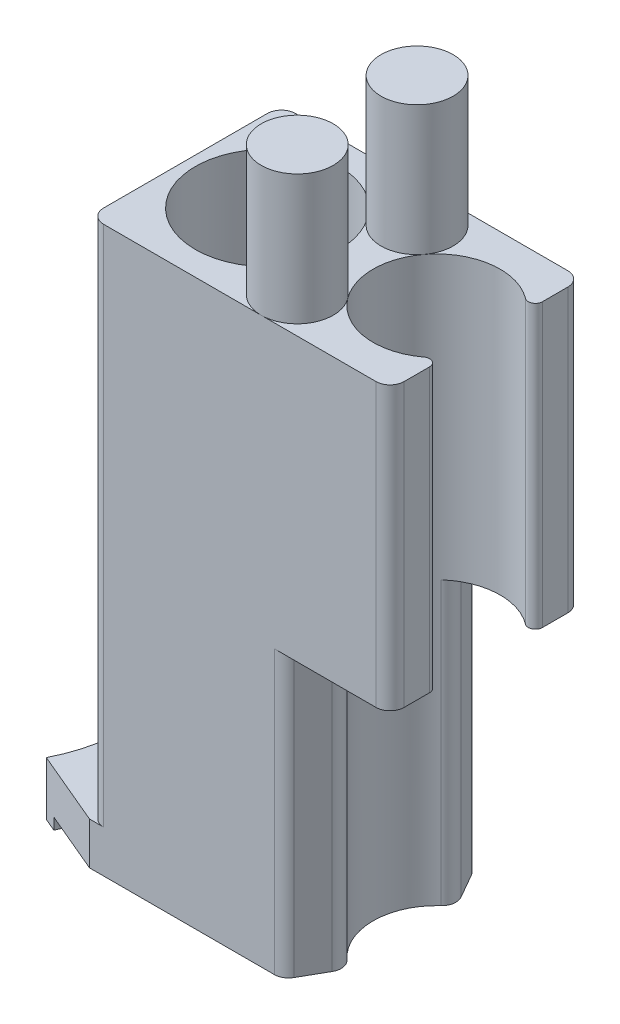
ISO-10303-21;
HEADER;
FILE_DESCRIPTION(('STEP AP214'),'2;1');
FILE_NAME('part.step','',(''),(''),'','','');
FILE_SCHEMA(('AUTOMOTIVE_DESIGN { 1 0 10303 214 1 1 1 1 }'));
ENDSEC;
DATA;
#1=APPLICATION_CONTEXT('core data for automotive mechanical design processes');
#2=APPLICATION_PROTOCOL_DEFINITION('international standard','automotive_design',2000,#1);
#3=PRODUCT_CONTEXT('',#1,'mechanical');
#4=PRODUCT('Part','Part','',(#3));
#5=PRODUCT_RELATED_PRODUCT_CATEGORY('part','',(#4));
#6=PRODUCT_DEFINITION_FORMATION('','',#4);
#7=PRODUCT_DEFINITION_CONTEXT('part definition',#1,'design');
#8=PRODUCT_DEFINITION('design','',#6,#7);
#9=PRODUCT_DEFINITION_SHAPE('','',#8);
#10=(LENGTH_UNIT() NAMED_UNIT(*) SI_UNIT(.MILLI.,.METRE.));
#11=(NAMED_UNIT(*) PLANE_ANGLE_UNIT() SI_UNIT($,.RADIAN.));
#12=(NAMED_UNIT(*) SI_UNIT($,.STERADIAN.) SOLID_ANGLE_UNIT());
#13=UNCERTAINTY_MEASURE_WITH_UNIT(LENGTH_MEASURE(1.E-05),#10,'distance_accuracy_value','');
#14=(GEOMETRIC_REPRESENTATION_CONTEXT(3) GLOBAL_UNCERTAINTY_ASSIGNED_CONTEXT((#13)) GLOBAL_UNIT_ASSIGNED_CONTEXT((#10,
#11,#12)) REPRESENTATION_CONTEXT('',''));
#15=CARTESIAN_POINT('',(0.,0.,0.));
#16=DIRECTION('',(0.,0.,1.));
#17=DIRECTION('',(1.,0.,0.));
#18=AXIS2_PLACEMENT_3D('',#15,#16,#17);
#19=CARTESIAN_POINT('',(0.,40.,0.));
#20=DIRECTION('',(0.,-1.,0.));
#21=DIRECTION('',(0.,0.,-1.));
#22=AXIS2_PLACEMENT_3D('',#19,#20,#21);
#23=PLANE('',#22);
#24=CARTESIAN_POINT('',(6.36768360179099,40.,4.24632796418012));
#25=DIRECTION('',(0.,1.,0.));
#26=DIRECTION('',(0.,0.,-1.));
#27=AXIS2_PLACEMENT_3D('',#24,#25,#26);
#28=CIRCLE('',#27,2.55367203581988);
#29=CARTESIAN_POINT('',(4.24308570019035,40.,2.82952712318548));
#30=VERTEX_POINT('',#29);
#31=CARTESIAN_POINT('',(6.36768360179099,40.,6.80000000000001));
#32=VERTEX_POINT('',#31);
#33=EDGE_CURVE('E250',#30,#32,#28,.T.);
#34=ORIENTED_EDGE('',*,*,#33,.F.);
#35=CARTESIAN_POINT('',(0.,40.,0.));
#36=DIRECTION('',(0.,1.,0.));
#37=DIRECTION('',(0.,0.,1.));
#38=AXIS2_PLACEMENT_3D('',#35,#36,#37);
#39=CIRCLE('',#38,5.1);
#40=CARTESIAN_POINT('',(4.24308570019035,40.,-2.82952712318548));
#41=VERTEX_POINT('',#40);
#42=EDGE_CURVE('E236',#41,#30,#39,.T.);
#43=ORIENTED_EDGE('',*,*,#42,.F.);
#44=CARTESIAN_POINT('',(6.36768360179099,40.,-4.24632796418012));
#45=DIRECTION('',(0.,1.,0.));
#46=DIRECTION('',(0.,0.,1.));
#47=AXIS2_PLACEMENT_3D('',#44,#45,#46);
#48=CIRCLE('',#47,2.55367203581988);
#49=CARTESIAN_POINT('',(6.36768360179099,40.,-6.79999999999999));
#50=VERTEX_POINT('',#49);
#51=EDGE_CURVE('E12',#50,#41,#48,.T.);
#52=ORIENTED_EDGE('',*,*,#51,.F.);
#53=DIRECTION('',(-1.,0.,0.));
#54=VECTOR('',#53,1.);
#55=CARTESIAN_POINT('',(-5.8,40.,-6.79999999999999));
#56=LINE('',#55,#54);
#57=CARTESIAN_POINT('',(-4.8,40.,-6.79999999999999));
#58=VERTEX_POINT('',#57);
#59=EDGE_CURVE('E348',#50,#58,#56,.T.);
#60=ORIENTED_EDGE('',*,*,#59,.T.);
#61=CARTESIAN_POINT('',(-4.8,40.,-5.79999999999999));
#62=DIRECTION('',(0.,-1.,0.));
#63=DIRECTION('',(0.,0.,-1.));
#64=AXIS2_PLACEMENT_3D('',#61,#62,#63);
#65=CIRCLE('',#64,1.);
#66=CARTESIAN_POINT('',(-5.8,40.,-5.79999999999999));
#67=VERTEX_POINT('',#66);
#68=EDGE_CURVE('E402',#58,#67,#65,.F.);
#69=ORIENTED_EDGE('',*,*,#68,.T.);
#70=DIRECTION('',(0.,0.,1.));
#71=VECTOR('',#70,1.);
#72=CARTESIAN_POINT('',(-5.8,40.,6.80000000000001));
#73=LINE('',#72,#71);
#74=CARTESIAN_POINT('',(-5.8,40.,5.80000000000001));
#75=VERTEX_POINT('',#74);
#76=EDGE_CURVE('E286',#67,#75,#73,.T.);
#77=ORIENTED_EDGE('',*,*,#76,.T.);
#78=CARTESIAN_POINT('',(-4.8,40.,5.80000000000001));
#79=DIRECTION('',(0.,-1.,0.));
#80=DIRECTION('',(0.,0.,-1.));
#81=AXIS2_PLACEMENT_3D('',#78,#79,#80);
#82=CIRCLE('',#81,1.);
#83=CARTESIAN_POINT('',(-4.8,40.,6.80000000000001));
#84=VERTEX_POINT('',#83);
#85=EDGE_CURVE('E400',#75,#84,#82,.F.);
#86=ORIENTED_EDGE('',*,*,#85,.T.);
#87=DIRECTION('',(1.,0.,0.));
#88=VECTOR('',#87,1.);
#89=CARTESIAN_POINT('',(7.88393549290576,40.,6.80000000000001));
#90=LINE('',#89,#88);
#91=EDGE_CURVE('E252',#84,#32,#90,.T.);
#92=ORIENTED_EDGE('',*,*,#91,.T.);
#93=EDGE_LOOP('',(#34,#43,#52,#60,#69,#77,#86,#92));
#94=FACE_BOUND('',#93,.T.);
#95=ADVANCED_FACE('F41',(#94),#23,.F.);
#96=CARTESIAN_POINT('',(8.40677597948551,40.,2.70901109971844));
#97=VERTEX_POINT('',#96);
#98=EDGE_CURVE('E59',#32,#97,#28,.T.);
#99=ORIENTED_EDGE('',*,*,#98,.F.);
#100=CARTESIAN_POINT('',(14.5,40.,6.80000000000001));
#101=VERTEX_POINT('',#100);
#102=EDGE_CURVE('E289',#32,#101,#90,.T.);
#103=ORIENTED_EDGE('',*,*,#102,.T.);
#104=CARTESIAN_POINT('',(14.5,40.,5.80000000000001));
#105=DIRECTION('',(0.,-1.,0.));
#106=DIRECTION('',(0.,0.,-1.));
#107=AXIS2_PLACEMENT_3D('',#104,#105,#106);
#108=CIRCLE('',#107,1.);
#109=CARTESIAN_POINT('',(15.5,40.,5.80000000000001));
#110=VERTEX_POINT('',#109);
#111=EDGE_CURVE('E404',#101,#110,#108,.F.);
#112=ORIENTED_EDGE('',*,*,#111,.T.);
#113=DIRECTION('',(0.,0.,1.));
#114=VECTOR('',#113,1.);
#115=CARTESIAN_POINT('',(15.5,40.,6.80000000000001));
#116=LINE('',#115,#114);
#117=CARTESIAN_POINT('',(15.5,40.,4.));
#118=VERTEX_POINT('',#117);
#119=EDGE_CURVE('E268',#118,#110,#116,.T.);
#120=ORIENTED_EDGE('',*,*,#119,.F.);
#121=CARTESIAN_POINT('',(15.,40.,4.));
#122=DIRECTION('',(0.,-1.,0.));
#123=DIRECTION('',(0.,0.,-1.));
#124=AXIS2_PLACEMENT_3D('',#121,#122,#123);
#125=CIRCLE('',#124,0.5);
#126=CARTESIAN_POINT('',(14.7,40.,3.6));
#127=VERTEX_POINT('',#126);
#128=EDGE_CURVE('E451',#118,#127,#125,.F.);
#129=ORIENTED_EDGE('',*,*,#128,.T.);
#130=CARTESIAN_POINT('',(12.,40.,0.));
#131=DIRECTION('',(0.,1.,0.));
#132=DIRECTION('',(0.,0.,1.));
#133=AXIS2_PLACEMENT_3D('',#130,#131,#132);
#134=CIRCLE('',#133,4.5);
#135=EDGE_CURVE('E265',#97,#127,#134,.T.);
#136=ORIENTED_EDGE('',*,*,#135,.F.);
#137=EDGE_LOOP('',(#99,#103,#112,#120,#129,#136));
#138=FACE_BOUND('',#137,.T.);
#139=ADVANCED_FACE('F519',(#138),#23,.F.);
#140=CARTESIAN_POINT('',(8.40677597948524,40.,-2.70901109971865));
#141=VERTEX_POINT('',#140);
#142=EDGE_CURVE('E52',#141,#50,#48,.T.);
#143=ORIENTED_EDGE('',*,*,#142,.F.);
#144=CARTESIAN_POINT('',(14.7,40.,-3.6));
#145=VERTEX_POINT('',#144);
#146=EDGE_CURVE('E266',#145,#141,#134,.T.);
#147=ORIENTED_EDGE('',*,*,#146,.F.);
#148=CARTESIAN_POINT('',(15.,40.,-4.));
#149=DIRECTION('',(0.,-1.,0.));
#150=DIRECTION('',(0.,0.,-1.));
#151=AXIS2_PLACEMENT_3D('',#148,#149,#150);
#152=CIRCLE('',#151,0.5);
#153=CARTESIAN_POINT('',(15.5,40.,-4.));
#154=VERTEX_POINT('',#153);
#155=EDGE_CURVE('E449',#145,#154,#152,.F.);
#156=ORIENTED_EDGE('',*,*,#155,.T.);
#157=DIRECTION('',(0.,0.,1.));
#158=VECTOR('',#157,1.);
#159=CARTESIAN_POINT('',(15.5,40.,-2.82842712474619));
#160=LINE('',#159,#158);
#161=CARTESIAN_POINT('',(15.5,40.,-5.79999999999999));
#162=VERTEX_POINT('',#161);
#163=EDGE_CURVE('E271',#162,#154,#160,.T.);
#164=ORIENTED_EDGE('',*,*,#163,.F.);
#165=CARTESIAN_POINT('',(14.5,40.,-5.79999999999999));
#166=DIRECTION('',(0.,-1.,0.));
#167=DIRECTION('',(0.,0.,-1.));
#168=AXIS2_PLACEMENT_3D('',#165,#166,#167);
#169=CIRCLE('',#168,1.);
#170=CARTESIAN_POINT('',(14.5,40.,-6.79999999999999));
#171=VERTEX_POINT('',#170);
#172=EDGE_CURVE('E407',#162,#171,#169,.F.);
#173=ORIENTED_EDGE('',*,*,#172,.T.);
#174=EDGE_CURVE('E349',#171,#50,#56,.T.);
#175=ORIENTED_EDGE('',*,*,#174,.T.);
#176=EDGE_LOOP('',(#143,#147,#156,#164,#173,#175));
#177=FACE_BOUND('',#176,.T.);
#178=ADVANCED_FACE('F479',(#177),#23,.F.);
#179=CARTESIAN_POINT('',(0.,20.,0.));
#180=DIRECTION('',(0.,-1.,0.));
#181=DIRECTION('',(0.,0.,-1.));
#182=AXIS2_PLACEMENT_3D('',#179,#180,#181);
#183=PLANE('',#182);
#184=DIRECTION('',(0.,0.,-1.));
#185=VECTOR('',#184,1.);
#186=CARTESIAN_POINT('',(15.5,20.,0.));
#187=LINE('',#186,#185);
#188=CARTESIAN_POINT('',(15.5,20.,-4.));
#189=VERTEX_POINT('',#188);
#190=CARTESIAN_POINT('',(15.5,20.,-5.79999999999999));
#191=VERTEX_POINT('',#190);
#192=EDGE_CURVE('E360',#189,#191,#187,.T.);
#193=ORIENTED_EDGE('',*,*,#192,.F.);
#194=CARTESIAN_POINT('',(15.,20.,-4.));
#195=DIRECTION('',(0.,-1.,0.));
#196=DIRECTION('',(0.,0.,-1.));
#197=AXIS2_PLACEMENT_3D('',#194,#195,#196);
#198=CIRCLE('',#197,0.5);
#199=CARTESIAN_POINT('',(14.7,20.,-3.6));
#200=VERTEX_POINT('',#199);
#201=EDGE_CURVE('E45',#189,#200,#198,.T.);
#202=ORIENTED_EDGE('',*,*,#201,.T.);
#203=CARTESIAN_POINT('',(12.,20.,0.));
#204=DIRECTION('',(0.,-1.,0.));
#205=DIRECTION('',(0.,0.,-1.));
#206=AXIS2_PLACEMENT_3D('',#203,#204,#205);
#207=CIRCLE('',#206,4.5);
#208=CARTESIAN_POINT('',(8.96870597252041,20.,-3.32584673714327));
#209=VERTEX_POINT('',#208);
#210=EDGE_CURVE('E361',#209,#200,#207,.T.);
#211=ORIENTED_EDGE('',*,*,#210,.F.);
#212=CARTESIAN_POINT('',(8.29508507752494,20.,-4.06492378984178));
#213=DIRECTION('',(0.,-1.,0.));
#214=DIRECTION('',(0.,0.,-1.));
#215=AXIS2_PLACEMENT_3D('',#212,#213,#214);
#216=CIRCLE('',#215,1.);
#217=CARTESIAN_POINT('',(9.1633282196494,20.,-4.56106272819861));
#218=VERTEX_POINT('',#217);
#219=EDGE_CURVE('E435',#209,#218,#216,.F.);
#220=ORIENTED_EDGE('',*,*,#219,.T.);
#221=DIRECTION('',(-0.496138938356834,0.,-0.868243142124459));
#222=VECTOR('',#221,1.);
#223=CARTESIAN_POINT('',(7.88393549290576,20.,-6.79999999999999));
#224=LINE('',#223,#222);
#225=CARTESIAN_POINT('',(8.171856099559,20.,-6.29613893835683));
#226=VERTEX_POINT('',#225);
#227=EDGE_CURVE('E352',#218,#226,#224,.T.);
#228=ORIENTED_EDGE('',*,*,#227,.T.);
#229=CARTESIAN_POINT('',(7.30361295743454,20.,-5.79999999999999));
#230=DIRECTION('',(0.,-1.,0.));
#231=DIRECTION('',(0.,0.,-1.));
#232=AXIS2_PLACEMENT_3D('',#229,#230,#231);
#233=CIRCLE('',#232,1.);
#234=CARTESIAN_POINT('',(7.30361295743454,20.,-6.79999999999999));
#235=VERTEX_POINT('',#234);
#236=EDGE_CURVE('E437',#226,#235,#233,.F.);
#237=ORIENTED_EDGE('',*,*,#236,.T.);
#238=DIRECTION('',(-1.,0.,0.));
#239=VECTOR('',#238,1.);
#240=CARTESIAN_POINT('',(7.88393549290576,20.,-6.79999999999999));
#241=LINE('',#240,#239);
#242=CARTESIAN_POINT('',(14.5,20.,-6.79999999999999));
#243=VERTEX_POINT('',#242);
#244=EDGE_CURVE('E280',#243,#235,#241,.T.);
#245=ORIENTED_EDGE('',*,*,#244,.F.);
#246=CARTESIAN_POINT('',(14.5,20.,-5.79999999999999));
#247=DIRECTION('',(0.,-1.,0.));
#248=DIRECTION('',(0.,0.,-1.));
#249=AXIS2_PLACEMENT_3D('',#246,#247,#248);
#250=CIRCLE('',#249,1.);
#251=EDGE_CURVE('E409',#243,#191,#250,.T.);
#252=ORIENTED_EDGE('',*,*,#251,.T.);
#253=EDGE_LOOP('',(#193,#202,#211,#220,#228,#237,#245,#252));
#254=FACE_BOUND('',#253,.T.);
#255=ADVANCED_FACE('F488',(#254),#183,.T.);
#256=CARTESIAN_POINT('',(11.76964977862,107.802,0.));
#257=DIRECTION('',(0.868243142124459,0.,0.496138938356833));
#258=DIRECTION('',(0.496138938356833,0.,-0.868243142124459));
#259=AXIS2_PLACEMENT_3D('',#256,#257,#258);
#260=PLANE('',#259);
#261=DIRECTION('',(-0.496138938356833,0.,0.868243142124459));
#262=VECTOR('',#261,1.);
#263=CARTESIAN_POINT('',(11.76964977862,0.,0.));
#264=LINE('',#263,#262);
#265=CARTESIAN_POINT('',(9.16332821964941,0.,4.56106272819862));
#266=VERTEX_POINT('',#265);
#267=CARTESIAN_POINT('',(8.171856099559,0.,6.29613893835684));
#268=VERTEX_POINT('',#267);
#269=EDGE_CURVE('E320',#266,#268,#264,.T.);
#270=ORIENTED_EDGE('',*,*,#269,.F.);
#271=DIRECTION('',(0.,-1.,0.));
#272=VECTOR('',#271,1.);
#273=CARTESIAN_POINT('',(9.16332821964941,20.,4.56106272819862));
#274=LINE('',#273,#272);
#275=CARTESIAN_POINT('',(9.16332821964941,20.,4.56106272819862));
#276=VERTEX_POINT('',#275);
#277=EDGE_CURVE('E380',#266,#276,#274,.F.);
#278=ORIENTED_EDGE('',*,*,#277,.T.);
#279=DIRECTION('',(0.496138938356833,0.,-0.868243142124459));
#280=VECTOR('',#279,1.);
#281=CARTESIAN_POINT('',(11.76964977862,20.,0.));
#282=LINE('',#281,#280);
#283=CARTESIAN_POINT('',(8.171856099559,20.,6.29613893835684));
#284=VERTEX_POINT('',#283);
#285=EDGE_CURVE('E247',#284,#276,#282,.T.);
#286=ORIENTED_EDGE('',*,*,#285,.F.);
#287=DIRECTION('',(0.,-1.,0.));
#288=VECTOR('',#287,1.);
#289=CARTESIAN_POINT('',(8.171856099559,107.802,6.29613893835684));
#290=LINE('',#289,#288);
#291=EDGE_CURVE('E377',#284,#268,#290,.T.);
#292=ORIENTED_EDGE('',*,*,#291,.T.);
#293=EDGE_LOOP('',(#270,#278,#286,#292));
#294=FACE_BOUND('',#293,.T.);
#295=ADVANCED_FACE('F567',(#294),#260,.T.);
#296=CARTESIAN_POINT('',(7.88393549290576,107.802,6.80000000000001));
#297=DIRECTION('',(0.,0.,1.));
#298=DIRECTION('',(1.,0.,0.));
#299=AXIS2_PLACEMENT_3D('',#296,#297,#298);
#300=PLANE('',#299);
#301=DIRECTION('',(1.,0.,0.));
#302=VECTOR('',#301,1.);
#303=CARTESIAN_POINT('',(22.8839354929058,20.,6.80000000000001));
#304=LINE('',#303,#302);
#305=CARTESIAN_POINT('',(7.30361295743454,20.,6.80000000000001));
#306=VERTEX_POINT('',#305);
#307=CARTESIAN_POINT('',(14.5,20.,6.80000000000001));
#308=VERTEX_POINT('',#307);
#309=EDGE_CURVE('E277',#306,#308,#304,.T.);
#310=ORIENTED_EDGE('',*,*,#309,.T.);
#311=DIRECTION('',(0.,1.,0.));
#312=VECTOR('',#311,1.);
#313=CARTESIAN_POINT('',(14.5,40.,6.80000000000001));
#314=LINE('',#313,#312);
#315=EDGE_CURVE('E420',#308,#101,#314,.T.);
#316=ORIENTED_EDGE('',*,*,#315,.T.);
#317=ORIENTED_EDGE('',*,*,#102,.F.);
#318=ORIENTED_EDGE('',*,*,#91,.F.);
#319=DIRECTION('',(0.,-1.,0.));
#320=VECTOR('',#319,1.);
#321=CARTESIAN_POINT('',(-4.8,107.802,6.80000000000001));
#322=LINE('',#321,#320);
#323=CARTESIAN_POINT('',(-4.8,3.,6.80000000000001));
#324=VERTEX_POINT('',#323);
#325=EDGE_CURVE('E414',#84,#324,#322,.T.);
#326=ORIENTED_EDGE('',*,*,#325,.T.);
#327=DIRECTION('',(-1.,0.,0.));
#328=VECTOR('',#327,1.);
#329=CARTESIAN_POINT('',(7.88393549290576,3.,6.80000000000001));
#330=LINE('',#329,#328);
#331=CARTESIAN_POINT('',(-5.8,3.,6.80000000000001));
#332=VERTEX_POINT('',#331);
#333=EDGE_CURVE('E412',#324,#332,#330,.T.);
#334=ORIENTED_EDGE('',*,*,#333,.T.);
#335=DIRECTION('',(0.,1.,0.));
#336=VECTOR('',#335,1.);
#337=CARTESIAN_POINT('',(-5.8,0.,6.80000000000001));
#338=LINE('',#337,#336);
#339=CARTESIAN_POINT('',(-5.8,0.,6.80000000000001));
#340=VERTEX_POINT('',#339);
#341=EDGE_CURVE('E336',#340,#332,#338,.T.);
#342=ORIENTED_EDGE('',*,*,#341,.F.);
#343=DIRECTION('',(-1.,0.,0.));
#344=VECTOR('',#343,1.);
#345=CARTESIAN_POINT('',(7.88393549290576,0.,6.80000000000001));
#346=LINE('',#345,#344);
#347=CARTESIAN_POINT('',(7.30361295743454,0.,6.80000000000001));
#348=VERTEX_POINT('',#347);
#349=EDGE_CURVE('E323',#348,#340,#346,.T.);
#350=ORIENTED_EDGE('',*,*,#349,.F.);
#351=DIRECTION('',(0.,-1.,0.));
#352=VECTOR('',#351,1.);
#353=CARTESIAN_POINT('',(7.30361295743454,107.802,6.80000000000001));
#354=LINE('',#353,#352);
#355=EDGE_CURVE('E417',#348,#306,#354,.F.);
#356=ORIENTED_EDGE('',*,*,#355,.T.);
#357=EDGE_LOOP('',(#310,#316,#317,#318,#326,#334,#342,#350,#356));
#358=FACE_BOUND('',#357,.T.);
#359=ADVANCED_FACE('F516',(#358),#300,.T.);
#360=CARTESIAN_POINT('',(7.88393549290576,107.802,-6.79999999999999));
#361=DIRECTION('',(0.868243142124459,0.,-0.496138938356834));
#362=DIRECTION('',(-0.496138938356834,0.,-0.868243142124459));
#363=AXIS2_PLACEMENT_3D('',#360,#361,#362);
#364=PLANE('',#363);
#365=ORIENTED_EDGE('',*,*,#227,.F.);
#366=DIRECTION('',(0.,-1.,0.));
#367=VECTOR('',#366,1.);
#368=CARTESIAN_POINT('',(9.1633282196494,0.,-4.56106272819861));
#369=LINE('',#368,#367);
#370=CARTESIAN_POINT('',(9.1633282196494,0.,-4.56106272819861));
#371=VERTEX_POINT('',#370);
#372=EDGE_CURVE('E384',#218,#371,#369,.T.);
#373=ORIENTED_EDGE('',*,*,#372,.T.);
#374=DIRECTION('',(0.496138938356834,0.,0.868243142124459));
#375=VECTOR('',#374,1.);
#376=CARTESIAN_POINT('',(7.88393549290576,0.,-6.79999999999999));
#377=LINE('',#376,#375);
#378=CARTESIAN_POINT('',(8.171856099559,0.,-6.29613893835683));
#379=VERTEX_POINT('',#378);
#380=EDGE_CURVE('E317',#379,#371,#377,.T.);
#381=ORIENTED_EDGE('',*,*,#380,.F.);
#382=DIRECTION('',(0.,-1.,0.));
#383=VECTOR('',#382,1.);
#384=CARTESIAN_POINT('',(8.171856099559,107.802,-6.29613893835683));
#385=LINE('',#384,#383);
#386=EDGE_CURVE('E382',#379,#226,#385,.F.);
#387=ORIENTED_EDGE('',*,*,#386,.T.);
#388=EDGE_LOOP('',(#365,#373,#381,#387));
#389=FACE_BOUND('',#388,.T.);
#390=ADVANCED_FACE('F651',(#389),#364,.T.);
#391=CARTESIAN_POINT('',(-5.8,107.802,6.80000000000001));
#392=DIRECTION('',(-1.,0.,0.));
#393=DIRECTION('',(0.,0.,1.));
#394=AXIS2_PLACEMENT_3D('',#391,#392,#393);
#395=PLANE('',#394);
#396=ORIENTED_EDGE('',*,*,#76,.F.);
#397=DIRECTION('',(0.,-1.,0.));
#398=VECTOR('',#397,1.);
#399=CARTESIAN_POINT('',(-5.8,107.802,-5.79999999999999));
#400=LINE('',#399,#398);
#401=CARTESIAN_POINT('',(-5.8,3.,-5.79999999999999));
#402=VERTEX_POINT('',#401);
#403=EDGE_CURVE('E429',#67,#402,#400,.T.);
#404=ORIENTED_EDGE('',*,*,#403,.T.);
#405=DIRECTION('',(0.,0.,-1.));
#406=VECTOR('',#405,1.);
#407=CARTESIAN_POINT('',(-5.8,3.,6.80000000000001));
#408=LINE('',#407,#406);
#409=CARTESIAN_POINT('',(-5.8,3.,5.80000000000001));
#410=VERTEX_POINT('',#409);
#411=EDGE_CURVE('E345',#410,#402,#408,.T.);
#412=ORIENTED_EDGE('',*,*,#411,.F.);
#413=DIRECTION('',(0.,-1.,0.));
#414=VECTOR('',#413,1.);
#415=CARTESIAN_POINT('',(-5.8,107.802,5.80000000000001));
#416=LINE('',#415,#414);
#417=EDGE_CURVE('E427',#410,#75,#416,.F.);
#418=ORIENTED_EDGE('',*,*,#417,.T.);
#419=EDGE_LOOP('',(#396,#404,#412,#418));
#420=FACE_BOUND('',#419,.T.);
#421=ADVANCED_FACE('F508',(#420),#395,.T.);
#422=CARTESIAN_POINT('',(-5.8,107.802,-6.79999999999999));
#423=DIRECTION('',(0.,0.,-1.));
#424=DIRECTION('',(-1.,0.,0.));
#425=AXIS2_PLACEMENT_3D('',#422,#423,#424);
#426=PLANE('',#425);
#427=ORIENTED_EDGE('',*,*,#244,.T.);
#428=DIRECTION('',(0.,-1.,0.));
#429=VECTOR('',#428,1.);
#430=CARTESIAN_POINT('',(7.30361295743454,107.802,-6.79999999999999));
#431=LINE('',#430,#429);
#432=CARTESIAN_POINT('',(7.30361295743454,0.,-6.79999999999999));
#433=VERTEX_POINT('',#432);
#434=EDGE_CURVE('E394',#235,#433,#431,.T.);
#435=ORIENTED_EDGE('',*,*,#434,.T.);
#436=DIRECTION('',(1.,0.,0.));
#437=VECTOR('',#436,1.);
#438=CARTESIAN_POINT('',(-5.8,0.,-6.79999999999999));
#439=LINE('',#438,#437);
#440=CARTESIAN_POINT('',(-5.8,0.,-6.79999999999999));
#441=VERTEX_POINT('',#440);
#442=EDGE_CURVE('E313',#441,#433,#439,.T.);
#443=ORIENTED_EDGE('',*,*,#442,.F.);
#444=DIRECTION('',(0.,1.,0.));
#445=VECTOR('',#444,1.);
#446=CARTESIAN_POINT('',(-5.8,0.,-6.79999999999999));
#447=LINE('',#446,#445);
#448=CARTESIAN_POINT('',(-5.8,3.,-6.79999999999999));
#449=VERTEX_POINT('',#448);
#450=EDGE_CURVE('E339',#441,#449,#447,.T.);
#451=ORIENTED_EDGE('',*,*,#450,.T.);
#452=DIRECTION('',(1.,0.,0.));
#453=VECTOR('',#452,1.);
#454=CARTESIAN_POINT('',(-5.8,3.,-6.79999999999999));
#455=LINE('',#454,#453);
#456=CARTESIAN_POINT('',(-4.8,3.,-6.79999999999999));
#457=VERTEX_POINT('',#456);
#458=EDGE_CURVE('E389',#449,#457,#455,.T.);
#459=ORIENTED_EDGE('',*,*,#458,.T.);
#460=DIRECTION('',(0.,-1.,0.));
#461=VECTOR('',#460,1.);
#462=CARTESIAN_POINT('',(-4.8,107.802,-6.79999999999999));
#463=LINE('',#462,#461);
#464=EDGE_CURVE('E386',#457,#58,#463,.F.);
#465=ORIENTED_EDGE('',*,*,#464,.T.);
#466=ORIENTED_EDGE('',*,*,#59,.F.);
#467=ORIENTED_EDGE('',*,*,#174,.F.);
#468=DIRECTION('',(0.,1.,0.));
#469=VECTOR('',#468,1.);
#470=CARTESIAN_POINT('',(14.5,20.,-6.79999999999999));
#471=LINE('',#470,#469);
#472=EDGE_CURVE('E392',#171,#243,#471,.F.);
#473=ORIENTED_EDGE('',*,*,#472,.T.);
#474=EDGE_LOOP('',(#427,#435,#443,#451,#459,#465,#466,#467,#473));
#475=FACE_BOUND('',#474,.T.);
#476=ADVANCED_FACE('F474',(#475),#426,.T.);
#477=CARTESIAN_POINT('',(-20.,0.,0.));
#478=DIRECTION('',(0.,1.,0.));
#479=DIRECTION('',(0.,0.,1.));
#480=AXIS2_PLACEMENT_3D('',#477,#478,#479);
#481=CYLINDRICAL_SURFACE('',#480,10.);
#482=CARTESIAN_POINT('',(-20.,3.,0.));
#483=DIRECTION('',(0.,1.,0.));
#484=DIRECTION('',(0.,0.,1.));
#485=AXIS2_PLACEMENT_3D('',#482,#483,#484);
#486=CIRCLE('',#485,10.);
#487=CARTESIAN_POINT('',(-11.1,3.,4.5596052460712));
#488=VERTEX_POINT('',#487);
#489=CARTESIAN_POINT('',(-11.1,3.,-4.5596052460712));
#490=VERTEX_POINT('',#489);
#491=EDGE_CURVE('E310',#488,#490,#486,.T.);
#492=ORIENTED_EDGE('',*,*,#491,.T.);
#493=DIRECTION('',(0.,1.,0.));
#494=VECTOR('',#493,1.);
#495=CARTESIAN_POINT('',(-11.1,0.,-4.5596052460712));
#496=LINE('',#495,#494);
#497=CARTESIAN_POINT('',(-11.1,-0.799999999999995,-4.5596052460712));
#498=VERTEX_POINT('',#497);
#499=EDGE_CURVE('E342',#498,#490,#496,.T.);
#500=ORIENTED_EDGE('',*,*,#499,.F.);
#501=CARTESIAN_POINT('',(-20.,-0.799999999999995,0.));
#502=DIRECTION('',(0.,1.,0.));
#503=DIRECTION('',(0.,0.,1.));
#504=AXIS2_PLACEMENT_3D('',#501,#502,#503);
#505=CIRCLE('',#504,10.);
#506=CARTESIAN_POINT('',(-11.1,-0.799999999999995,4.5596052460712));
#507=VERTEX_POINT('',#506);
#508=EDGE_CURVE('E292',#507,#498,#505,.T.);
#509=ORIENTED_EDGE('',*,*,#508,.F.);
#510=DIRECTION('',(0.,1.,0.));
#511=VECTOR('',#510,1.);
#512=CARTESIAN_POINT('',(-11.1,0.,4.5596052460712));
#513=LINE('',#512,#511);
#514=EDGE_CURVE('E327',#507,#488,#513,.T.);
#515=ORIENTED_EDGE('',*,*,#514,.T.);
#516=EDGE_LOOP('',(#492,#500,#509,#515));
#517=FACE_BOUND('',#516,.T.);
#518=ADVANCED_FACE('F639',(#517),#481,.F.);
#519=CARTESIAN_POINT('',(-5.8,0.,-6.79999999999999));
#520=DIRECTION('',(0.38935799543113,0.,0.921086505923223));
#521=DIRECTION('',(0.921086505923223,0.,-0.38935799543113));
#522=AXIS2_PLACEMENT_3D('',#519,#520,#521);
#523=PLANE('',#522);
#524=DIRECTION('',(0.921086505923223,0.,-0.38935799543113));
#525=VECTOR('',#524,1.);
#526=CARTESIAN_POINT('',(-5.8,3.,-6.79999999999999));
#527=LINE('',#526,#525);
#528=EDGE_CURVE('E330',#490,#449,#527,.T.);
#529=ORIENTED_EDGE('',*,*,#528,.T.);
#530=ORIENTED_EDGE('',*,*,#450,.F.);
#531=DIRECTION('',(0.921086505923223,0.,-0.38935799543113));
#532=VECTOR('',#531,1.);
#533=CARTESIAN_POINT('',(-5.8,0.,-6.79999999999999));
#534=LINE('',#533,#532);
#535=CARTESIAN_POINT('',(-10.1766463825091,0.,-4.94992158581608));
#536=VERTEX_POINT('',#535);
#537=EDGE_CURVE('E311',#536,#441,#534,.T.);
#538=ORIENTED_EDGE('',*,*,#537,.F.);
#539=DIRECTION('',(0.,1.,0.));
#540=VECTOR('',#539,1.);
#541=CARTESIAN_POINT('',(-10.1766463825091,-0.799999999999995,-4.94992158581607));
#542=LINE('',#541,#540);
#543=CARTESIAN_POINT('',(-10.1766463825091,-0.799999999999995,-4.94992158581607));
#544=VERTEX_POINT('',#543);
#545=EDGE_CURVE('E307',#544,#536,#542,.T.);
#546=ORIENTED_EDGE('',*,*,#545,.F.);
#547=DIRECTION('',(0.921086505923224,0.,-0.389357995431129));
#548=VECTOR('',#547,1.);
#549=CARTESIAN_POINT('',(-11.1,-0.799999999999995,-4.5596052460712));
#550=LINE('',#549,#548);
#551=EDGE_CURVE('E295',#498,#544,#550,.T.);
#552=ORIENTED_EDGE('',*,*,#551,.F.);
#553=ORIENTED_EDGE('',*,*,#499,.T.);
#554=EDGE_LOOP('',(#529,#530,#538,#546,#552,#553));
#555=FACE_BOUND('',#554,.T.);
#556=ADVANCED_FACE('F500',(#555),#523,.F.);
#557=CARTESIAN_POINT('',(-11.1,0.,4.5596052460712));
#558=DIRECTION('',(0.389357995431133,0.,-0.921086505923222));
#559=DIRECTION('',(-0.921086505923222,0.,-0.389357995431133));
#560=AXIS2_PLACEMENT_3D('',#557,#558,#559);
#561=PLANE('',#560);
#562=DIRECTION('',(-0.921086505923222,0.,-0.389357995431133));
#563=VECTOR('',#562,1.);
#564=CARTESIAN_POINT('',(-11.1,3.,4.5596052460712));
#565=LINE('',#564,#563);
#566=EDGE_CURVE('E314',#332,#488,#565,.T.);
#567=ORIENTED_EDGE('',*,*,#566,.T.);
#568=ORIENTED_EDGE('',*,*,#514,.F.);
#569=DIRECTION('',(-0.921086505923222,0.,-0.389357995431132));
#570=VECTOR('',#569,1.);
#571=CARTESIAN_POINT('',(-11.1,-0.799999999999995,4.5596052460712));
#572=LINE('',#571,#570);
#573=CARTESIAN_POINT('',(-10.1766463825091,-0.799999999999995,4.94992158581608));
#574=VERTEX_POINT('',#573);
#575=EDGE_CURVE('E299',#574,#507,#572,.T.);
#576=ORIENTED_EDGE('',*,*,#575,.F.);
#577=DIRECTION('',(0.,1.,0.));
#578=VECTOR('',#577,1.);
#579=CARTESIAN_POINT('',(-10.1766463825091,-0.799999999999995,4.94992158581608));
#580=LINE('',#579,#578);
#581=CARTESIAN_POINT('',(-10.1766463825091,0.,4.94992158581608));
#582=VERTEX_POINT('',#581);
#583=EDGE_CURVE('E302',#574,#582,#580,.T.);
#584=ORIENTED_EDGE('',*,*,#583,.T.);
#585=DIRECTION('',(-0.921086505923222,0.,-0.389357995431133));
#586=VECTOR('',#585,1.);
#587=CARTESIAN_POINT('',(-11.1,0.,4.5596052460712));
#588=LINE('',#587,#586);
#589=EDGE_CURVE('E325',#340,#582,#588,.T.);
#590=ORIENTED_EDGE('',*,*,#589,.F.);
#591=ORIENTED_EDGE('',*,*,#341,.T.);
#592=EDGE_LOOP('',(#567,#568,#576,#584,#590,#591));
#593=FACE_BOUND('',#592,.T.);
#594=ADVANCED_FACE('F757',(#593),#561,.F.);
#595=CARTESIAN_POINT('',(-20.,0.,0.));
#596=DIRECTION('',(0.,1.,0.));
#597=DIRECTION('',(0.,0.,1.));
#598=AXIS2_PLACEMENT_3D('',#595,#596,#597);
#599=PLANE('',#598);
#600=CARTESIAN_POINT('',(0.,0.,0.));
#601=DIRECTION('',(0.,1.,0.));
#602=DIRECTION('',(0.,0.,1.));
#603=AXIS2_PLACEMENT_3D('',#600,#601,#602);
#604=CIRCLE('',#603,5.1);
#605=CARTESIAN_POINT('',(0.,0.,5.1));
#606=VERTEX_POINT('',#605);
#607=EDGE_CURVE('E243',#606,#606,#604,.T.);
#608=ORIENTED_EDGE('',*,*,#607,.T.);
#609=EDGE_LOOP('',(#608));
#610=FACE_BOUND('',#609,.T.);
#611=CARTESIAN_POINT('',(12.,0.,0.));
#612=DIRECTION('',(0.,1.,0.));
#613=DIRECTION('',(0.,0.,1.));
#614=AXIS2_PLACEMENT_3D('',#611,#612,#613);
#615=CIRCLE('',#614,4.5);
#616=CARTESIAN_POINT('',(8.96870597252041,0.,-3.32584673714327));
#617=VERTEX_POINT('',#616);
#618=CARTESIAN_POINT('',(8.96870597252042,0.,3.32584673714328));
#619=VERTEX_POINT('',#618);
#620=EDGE_CURVE('E274',#617,#619,#615,.T.);
#621=ORIENTED_EDGE('',*,*,#620,.T.);
#622=CARTESIAN_POINT('',(8.29508507752495,0.,4.06492378984179));
#623=DIRECTION('',(0.,1.,0.));
#624=DIRECTION('',(0.,0.,1.));
#625=AXIS2_PLACEMENT_3D('',#622,#623,#624);
#626=CIRCLE('',#625,1.);
#627=EDGE_CURVE('E375',#619,#266,#626,.F.);
#628=ORIENTED_EDGE('',*,*,#627,.T.);
#629=ORIENTED_EDGE('',*,*,#269,.T.);
#630=CARTESIAN_POINT('',(7.30361295743454,0.,5.80000000000001));
#631=DIRECTION('',(0.,1.,0.));
#632=DIRECTION('',(0.,0.,1.));
#633=AXIS2_PLACEMENT_3D('',#630,#631,#632);
#634=CIRCLE('',#633,1.);
#635=EDGE_CURVE('E369',#268,#348,#634,.F.);
#636=ORIENTED_EDGE('',*,*,#635,.T.);
#637=ORIENTED_EDGE('',*,*,#349,.T.);
#638=ORIENTED_EDGE('',*,*,#589,.T.);
#639=CARTESIAN_POINT('',(-20.,0.,0.));
#640=DIRECTION('',(0.,-1.,0.));
#641=DIRECTION('',(0.,0.,1.));
#642=AXIS2_PLACEMENT_3D('',#639,#640,#641);
#643=CIRCLE('',#642,11.);
#644=EDGE_CURVE('E291',#536,#582,#643,.T.);
#645=ORIENTED_EDGE('',*,*,#644,.F.);
#646=ORIENTED_EDGE('',*,*,#537,.T.);
#647=ORIENTED_EDGE('',*,*,#442,.T.);
#648=CARTESIAN_POINT('',(7.30361295743454,0.,-5.79999999999999));
#649=DIRECTION('',(0.,1.,0.));
#650=DIRECTION('',(0.,0.,1.));
#651=AXIS2_PLACEMENT_3D('',#648,#649,#650);
#652=CIRCLE('',#651,1.);
#653=EDGE_CURVE('E371',#433,#379,#652,.F.);
#654=ORIENTED_EDGE('',*,*,#653,.T.);
#655=ORIENTED_EDGE('',*,*,#380,.T.);
#656=CARTESIAN_POINT('',(8.29508507752494,0.,-4.06492378984178));
#657=DIRECTION('',(0.,1.,0.));
#658=DIRECTION('',(0.,0.,1.));
#659=AXIS2_PLACEMENT_3D('',#656,#657,#658);
#660=CIRCLE('',#659,1.);
#661=EDGE_CURVE('E373',#371,#617,#660,.F.);
#662=ORIENTED_EDGE('',*,*,#661,.T.);
#663=EDGE_LOOP('',(#621,#628,#629,#636,#637,#638,#645,#646,#647,#654,#655,#662));
#664=FACE_BOUND('',#663,.T.);
#665=ADVANCED_FACE('F494',(#610,#664),#599,.F.);
#666=CARTESIAN_POINT('',(-20.,3.,0.));
#667=DIRECTION('',(0.,1.,0.));
#668=DIRECTION('',(0.,0.,1.));
#669=AXIS2_PLACEMENT_3D('',#666,#667,#668);
#670=PLANE('',#669);
#671=ORIENTED_EDGE('',*,*,#566,.F.);
#672=ORIENTED_EDGE('',*,*,#333,.F.);
#673=CARTESIAN_POINT('',(-4.8,3.,5.80000000000001));
#674=DIRECTION('',(0.,1.,0.));
#675=DIRECTION('',(0.,0.,1.));
#676=AXIS2_PLACEMENT_3D('',#673,#674,#675);
#677=CIRCLE('',#676,1.);
#678=EDGE_CURVE('E444',#324,#410,#677,.F.);
#679=ORIENTED_EDGE('',*,*,#678,.T.);
#680=ORIENTED_EDGE('',*,*,#411,.T.);
#681=CARTESIAN_POINT('',(-4.8,3.,-5.79999999999999));
#682=DIRECTION('',(0.,1.,0.));
#683=DIRECTION('',(0.,0.,1.));
#684=AXIS2_PLACEMENT_3D('',#681,#682,#683);
#685=CIRCLE('',#684,1.);
#686=EDGE_CURVE('E442',#402,#457,#685,.F.);
#687=ORIENTED_EDGE('',*,*,#686,.T.);
#688=ORIENTED_EDGE('',*,*,#458,.F.);
#689=ORIENTED_EDGE('',*,*,#528,.F.);
#690=ORIENTED_EDGE('',*,*,#491,.F.);
#691=EDGE_LOOP('',(#671,#672,#679,#680,#687,#688,#689,#690));
#692=FACE_BOUND('',#691,.T.);
#693=ADVANCED_FACE('F770',(#692),#670,.T.);
#694=CARTESIAN_POINT('',(-20.,-0.799999999999995,0.));
#695=DIRECTION('',(0.,1.,0.));
#696=DIRECTION('',(0.,0.,1.));
#697=AXIS2_PLACEMENT_3D('',#694,#695,#696);
#698=CYLINDRICAL_SURFACE('',#697,11.);
#699=ORIENTED_EDGE('',*,*,#644,.T.);
#700=ORIENTED_EDGE('',*,*,#583,.F.);
#701=CARTESIAN_POINT('',(-20.,-0.799999999999995,0.));
#702=DIRECTION('',(0.,-1.,0.));
#703=DIRECTION('',(0.,0.,1.));
#704=AXIS2_PLACEMENT_3D('',#701,#702,#703);
#705=CIRCLE('',#704,11.);
#706=EDGE_CURVE('E297',#544,#574,#705,.T.);
#707=ORIENTED_EDGE('',*,*,#706,.F.);
#708=ORIENTED_EDGE('',*,*,#545,.T.);
#709=EDGE_LOOP('',(#699,#700,#707,#708));
#710=FACE_BOUND('',#709,.T.);
#711=ADVANCED_FACE('F561',(#710),#698,.T.);
#712=CARTESIAN_POINT('',(-20.,-0.799999999999995,0.));
#713=DIRECTION('',(0.,1.,0.));
#714=DIRECTION('',(0.,0.,1.));
#715=AXIS2_PLACEMENT_3D('',#712,#713,#714);
#716=PLANE('',#715);
#717=ORIENTED_EDGE('',*,*,#508,.T.);
#718=ORIENTED_EDGE('',*,*,#551,.T.);
#719=ORIENTED_EDGE('',*,*,#706,.T.);
#720=ORIENTED_EDGE('',*,*,#575,.T.);
#721=EDGE_LOOP('',(#717,#718,#719,#720));
#722=FACE_BOUND('',#721,.T.);
#723=ADVANCED_FACE('F556',(#722),#716,.F.);
#724=EDGE_CURVE('E67',#97,#30,#28,.T.);
#725=ORIENTED_EDGE('',*,*,#724,.F.);
#726=EDGE_CURVE('E269',#141,#97,#134,.T.);
#727=ORIENTED_EDGE('',*,*,#726,.F.);
#728=EDGE_CURVE('E50',#41,#141,#48,.T.);
#729=ORIENTED_EDGE('',*,*,#728,.F.);
#730=EDGE_CURVE('E239',#30,#41,#39,.T.);
#731=ORIENTED_EDGE('',*,*,#730,.F.);
#732=EDGE_LOOP('',(#725,#727,#729,#731));
#733=FACE_BOUND('',#732,.T.);
#734=ADVANCED_FACE('F245',(#733),#23,.F.);
#735=CARTESIAN_POINT('',(0.,-0.799999999999995,0.));
#736=DIRECTION('',(0.,1.,0.));
#737=DIRECTION('',(0.,0.,1.));
#738=AXIS2_PLACEMENT_3D('',#735,#736,#737);
#739=CYLINDRICAL_SURFACE('',#738,5.1);
#740=ORIENTED_EDGE('',*,*,#42,.T.);
#741=ORIENTED_EDGE('',*,*,#730,.T.);
#742=EDGE_LOOP('',(#740,#741));
#743=FACE_BOUND('',#742,.T.);
#744=ORIENTED_EDGE('',*,*,#607,.F.);
#745=EDGE_LOOP('',(#744));
#746=FACE_BOUND('',#745,.T.);
#747=ADVANCED_FACE('F237',(#743,#746),#739,.F.);
#748=CARTESIAN_POINT('',(14.7,20.,3.6));
#749=VERTEX_POINT('',#748);
#750=CARTESIAN_POINT('',(8.96870597252042,20.,3.32584673714328));
#751=VERTEX_POINT('',#750);
#752=EDGE_CURVE('E358',#749,#751,#207,.T.);
#753=ORIENTED_EDGE('',*,*,#752,.F.);
#754=CARTESIAN_POINT('',(15.,20.,4.));
#755=DIRECTION('',(0.,-1.,0.));
#756=DIRECTION('',(0.,0.,-1.));
#757=AXIS2_PLACEMENT_3D('',#754,#755,#756);
#758=CIRCLE('',#757,0.5);
#759=CARTESIAN_POINT('',(15.5,20.,4.));
#760=VERTEX_POINT('',#759);
#761=EDGE_CURVE('E459',#749,#760,#758,.T.);
#762=ORIENTED_EDGE('',*,*,#761,.T.);
#763=DIRECTION('',(0.,0.,-1.));
#764=VECTOR('',#763,1.);
#765=CARTESIAN_POINT('',(15.5,20.,0.));
#766=LINE('',#765,#764);
#767=CARTESIAN_POINT('',(15.5,20.,5.80000000000001));
#768=VERTEX_POINT('',#767);
#769=EDGE_CURVE('E355',#768,#760,#766,.T.);
#770=ORIENTED_EDGE('',*,*,#769,.F.);
#771=CARTESIAN_POINT('',(14.5,20.,5.80000000000001));
#772=DIRECTION('',(0.,-1.,0.));
#773=DIRECTION('',(0.,0.,-1.));
#774=AXIS2_PLACEMENT_3D('',#771,#772,#773);
#775=CIRCLE('',#774,1.);
#776=EDGE_CURVE('E425',#768,#308,#775,.T.);
#777=ORIENTED_EDGE('',*,*,#776,.T.);
#778=ORIENTED_EDGE('',*,*,#309,.F.);
#779=CARTESIAN_POINT('',(7.30361295743454,20.,5.80000000000001));
#780=DIRECTION('',(0.,-1.,0.));
#781=DIRECTION('',(0.,0.,-1.));
#782=AXIS2_PLACEMENT_3D('',#779,#780,#781);
#783=CIRCLE('',#782,1.);
#784=EDGE_CURVE('E440',#306,#284,#783,.F.);
#785=ORIENTED_EDGE('',*,*,#784,.T.);
#786=ORIENTED_EDGE('',*,*,#285,.T.);
#787=CARTESIAN_POINT('',(8.29508507752495,20.,4.06492378984179));
#788=DIRECTION('',(0.,-1.,0.));
#789=DIRECTION('',(0.,0.,-1.));
#790=AXIS2_PLACEMENT_3D('',#787,#788,#789);
#791=CIRCLE('',#790,1.);
#792=EDGE_CURVE('E432',#276,#751,#791,.F.);
#793=ORIENTED_EDGE('',*,*,#792,.T.);
#794=EDGE_LOOP('',(#753,#762,#770,#777,#778,#785,#786,#793));
#795=FACE_BOUND('',#794,.T.);
#796=ADVANCED_FACE('F531',(#795),#183,.T.);
#797=CARTESIAN_POINT('',(12.,-0.799999999999995,0.));
#798=DIRECTION('',(0.,1.,0.));
#799=DIRECTION('',(0.,0.,1.));
#800=AXIS2_PLACEMENT_3D('',#797,#798,#799);
#801=CYLINDRICAL_SURFACE('',#800,4.5);
#802=ORIENTED_EDGE('',*,*,#146,.T.);
#803=ORIENTED_EDGE('',*,*,#726,.T.);
#804=ORIENTED_EDGE('',*,*,#135,.T.);
#805=DIRECTION('',(0.,1.,0.));
#806=VECTOR('',#805,1.);
#807=CARTESIAN_POINT('',(14.7,-0.799999999999995,3.6));
#808=LINE('',#807,#806);
#809=EDGE_CURVE('E457',#127,#749,#808,.F.);
#810=ORIENTED_EDGE('',*,*,#809,.T.);
#811=ORIENTED_EDGE('',*,*,#752,.T.);
#812=DIRECTION('',(0.,1.,0.));
#813=VECTOR('',#812,1.);
#814=CARTESIAN_POINT('',(8.96870597252042,-0.799999999999995,3.32584673714328));
#815=LINE('',#814,#813);
#816=EDGE_CURVE('E366',#751,#619,#815,.F.);
#817=ORIENTED_EDGE('',*,*,#816,.T.);
#818=ORIENTED_EDGE('',*,*,#620,.F.);
#819=DIRECTION('',(0.,1.,0.));
#820=VECTOR('',#819,1.);
#821=CARTESIAN_POINT('',(8.96870597252041,-0.799999999999995,-3.32584673714327));
#822=LINE('',#821,#820);
#823=EDGE_CURVE('E363',#617,#209,#822,.T.);
#824=ORIENTED_EDGE('',*,*,#823,.T.);
#825=ORIENTED_EDGE('',*,*,#210,.T.);
#826=DIRECTION('',(0.,1.,0.));
#827=VECTOR('',#826,1.);
#828=CARTESIAN_POINT('',(14.7,-0.799999999999995,-3.6));
#829=LINE('',#828,#827);
#830=EDGE_CURVE('E454',#200,#145,#829,.T.);
#831=ORIENTED_EDGE('',*,*,#830,.T.);
#832=EDGE_LOOP('',(#802,#803,#804,#810,#811,#817,#818,#824,#825,#831));
#833=FACE_BOUND('',#832,.T.);
#834=ADVANCED_FACE('F538',(#833),#801,.F.);
#835=CARTESIAN_POINT('',(15.5,-0.799999999999995,-2.82842712474619));
#836=DIRECTION('',(-1.,0.,0.));
#837=DIRECTION('',(0.,0.,1.));
#838=AXIS2_PLACEMENT_3D('',#835,#836,#837);
#839=PLANE('',#838);
#840=ORIENTED_EDGE('',*,*,#163,.T.);
#841=DIRECTION('',(0.,1.,0.));
#842=VECTOR('',#841,1.);
#843=CARTESIAN_POINT('',(15.5,-0.799999999999995,-4.));
#844=LINE('',#843,#842);
#845=EDGE_CURVE('E460',#154,#189,#844,.F.);
#846=ORIENTED_EDGE('',*,*,#845,.T.);
#847=ORIENTED_EDGE('',*,*,#192,.T.);
#848=DIRECTION('',(0.,1.,0.));
#849=VECTOR('',#848,1.);
#850=CARTESIAN_POINT('',(15.5,40.,-5.79999999999999));
#851=LINE('',#850,#849);
#852=EDGE_CURVE('E397',#191,#162,#851,.T.);
#853=ORIENTED_EDGE('',*,*,#852,.T.);
#854=EDGE_LOOP('',(#840,#846,#847,#853));
#855=FACE_BOUND('',#854,.T.);
#856=ADVANCED_FACE('F486',(#855),#839,.F.);
#857=CARTESIAN_POINT('',(15.5,-0.799999999999995,6.80000000000001));
#858=DIRECTION('',(-1.,0.,0.));
#859=DIRECTION('',(0.,0.,1.));
#860=AXIS2_PLACEMENT_3D('',#857,#858,#859);
#861=PLANE('',#860);
#862=ORIENTED_EDGE('',*,*,#769,.T.);
#863=DIRECTION('',(0.,1.,0.));
#864=VECTOR('',#863,1.);
#865=CARTESIAN_POINT('',(15.5,-0.799999999999995,4.));
#866=LINE('',#865,#864);
#867=EDGE_CURVE('E446',#760,#118,#866,.T.);
#868=ORIENTED_EDGE('',*,*,#867,.T.);
#869=ORIENTED_EDGE('',*,*,#119,.T.);
#870=DIRECTION('',(0.,1.,0.));
#871=VECTOR('',#870,1.);
#872=CARTESIAN_POINT('',(15.5,20.,5.80000000000001));
#873=LINE('',#872,#871);
#874=EDGE_CURVE('E423',#110,#768,#873,.F.);
#875=ORIENTED_EDGE('',*,*,#874,.T.);
#876=EDGE_LOOP('',(#862,#868,#869,#875));
#877=FACE_BOUND('',#876,.T.);
#878=ADVANCED_FACE('F527',(#877),#861,.F.);
#879=CARTESIAN_POINT('',(8.29508507752495,-0.799999999999995,4.06492378984179));
#880=DIRECTION('',(0.,1.,0.));
#881=DIRECTION('',(0.,0.,1.));
#882=AXIS2_PLACEMENT_3D('',#879,#880,#881);
#883=CYLINDRICAL_SURFACE('',#882,1.);
#884=ORIENTED_EDGE('',*,*,#792,.F.);
#885=ORIENTED_EDGE('',*,*,#277,.F.);
#886=ORIENTED_EDGE('',*,*,#627,.F.);
#887=ORIENTED_EDGE('',*,*,#816,.F.);
#888=EDGE_LOOP('',(#884,#885,#886,#887));
#889=FACE_BOUND('',#888,.T.);
#890=ADVANCED_FACE('F585',(#889),#883,.T.);
#891=CARTESIAN_POINT('',(8.29508507752494,-0.799999999999995,-4.06492378984178));
#892=DIRECTION('',(0.,1.,0.));
#893=DIRECTION('',(0.,0.,1.));
#894=AXIS2_PLACEMENT_3D('',#891,#892,#893);
#895=CYLINDRICAL_SURFACE('',#894,1.);
#896=ORIENTED_EDGE('',*,*,#661,.F.);
#897=ORIENTED_EDGE('',*,*,#372,.F.);
#898=ORIENTED_EDGE('',*,*,#219,.F.);
#899=ORIENTED_EDGE('',*,*,#823,.F.);
#900=EDGE_LOOP('',(#896,#897,#898,#899));
#901=FACE_BOUND('',#900,.T.);
#902=ADVANCED_FACE('F713',(#901),#895,.T.);
#903=CARTESIAN_POINT('',(7.30361295743454,107.802,-5.79999999999999));
#904=DIRECTION('',(0.,-1.,0.));
#905=DIRECTION('',(0.,0.,-1.));
#906=AXIS2_PLACEMENT_3D('',#903,#904,#905);
#907=CYLINDRICAL_SURFACE('',#906,1.);
#908=ORIENTED_EDGE('',*,*,#236,.F.);
#909=ORIENTED_EDGE('',*,*,#386,.F.);
#910=ORIENTED_EDGE('',*,*,#653,.F.);
#911=ORIENTED_EDGE('',*,*,#434,.F.);
#912=EDGE_LOOP('',(#908,#909,#910,#911));
#913=FACE_BOUND('',#912,.T.);
#914=ADVANCED_FACE('F709',(#913),#907,.T.);
#915=CARTESIAN_POINT('',(14.5,-0.799999999999995,-5.79999999999999));
#916=DIRECTION('',(0.,-1.,0.));
#917=DIRECTION('',(0.,0.,-1.));
#918=AXIS2_PLACEMENT_3D('',#915,#916,#917);
#919=CYLINDRICAL_SURFACE('',#918,1.);
#920=ORIENTED_EDGE('',*,*,#251,.F.);
#921=ORIENTED_EDGE('',*,*,#472,.F.);
#922=ORIENTED_EDGE('',*,*,#172,.F.);
#923=ORIENTED_EDGE('',*,*,#852,.F.);
#924=EDGE_LOOP('',(#920,#921,#922,#923));
#925=FACE_BOUND('',#924,.T.);
#926=ADVANCED_FACE('F485',(#925),#919,.T.);
#927=CARTESIAN_POINT('',(14.5,107.802,5.80000000000001));
#928=DIRECTION('',(0.,-1.,0.));
#929=DIRECTION('',(0.,0.,-1.));
#930=AXIS2_PLACEMENT_3D('',#927,#928,#929);
#931=CYLINDRICAL_SURFACE('',#930,1.);
#932=ORIENTED_EDGE('',*,*,#776,.F.);
#933=ORIENTED_EDGE('',*,*,#874,.F.);
#934=ORIENTED_EDGE('',*,*,#111,.F.);
#935=ORIENTED_EDGE('',*,*,#315,.F.);
#936=EDGE_LOOP('',(#932,#933,#934,#935));
#937=FACE_BOUND('',#936,.T.);
#938=ADVANCED_FACE('F524',(#937),#931,.T.);
#939=CARTESIAN_POINT('',(7.30361295743454,107.802,5.80000000000001));
#940=DIRECTION('',(0.,-1.,0.));
#941=DIRECTION('',(0.,0.,-1.));
#942=AXIS2_PLACEMENT_3D('',#939,#940,#941);
#943=CYLINDRICAL_SURFACE('',#942,1.);
#944=ORIENTED_EDGE('',*,*,#784,.F.);
#945=ORIENTED_EDGE('',*,*,#355,.F.);
#946=ORIENTED_EDGE('',*,*,#635,.F.);
#947=ORIENTED_EDGE('',*,*,#291,.F.);
#948=EDGE_LOOP('',(#944,#945,#946,#947));
#949=FACE_BOUND('',#948,.T.);
#950=ADVANCED_FACE('F704',(#949),#943,.T.);
#951=CARTESIAN_POINT('',(-4.8,107.802,-5.79999999999999));
#952=DIRECTION('',(0.,-1.,0.));
#953=DIRECTION('',(0.,0.,-1.));
#954=AXIS2_PLACEMENT_3D('',#951,#952,#953);
#955=CYLINDRICAL_SURFACE('',#954,1.);
#956=ORIENTED_EDGE('',*,*,#68,.F.);
#957=ORIENTED_EDGE('',*,*,#464,.F.);
#958=ORIENTED_EDGE('',*,*,#686,.F.);
#959=ORIENTED_EDGE('',*,*,#403,.F.);
#960=EDGE_LOOP('',(#956,#957,#958,#959));
#961=FACE_BOUND('',#960,.T.);
#962=ADVANCED_FACE('F503',(#961),#955,.T.);
#963=CARTESIAN_POINT('',(-4.8,107.802,5.80000000000001));
#964=DIRECTION('',(0.,-1.,0.));
#965=DIRECTION('',(0.,0.,-1.));
#966=AXIS2_PLACEMENT_3D('',#963,#964,#965);
#967=CYLINDRICAL_SURFACE('',#966,1.);
#968=ORIENTED_EDGE('',*,*,#85,.F.);
#969=ORIENTED_EDGE('',*,*,#417,.F.);
#970=ORIENTED_EDGE('',*,*,#678,.F.);
#971=ORIENTED_EDGE('',*,*,#325,.F.);
#972=EDGE_LOOP('',(#968,#969,#970,#971));
#973=FACE_BOUND('',#972,.T.);
#974=ADVANCED_FACE('F512',(#973),#967,.T.);
#975=CARTESIAN_POINT('',(15.,-0.799999999999995,4.));
#976=DIRECTION('',(0.,1.,0.));
#977=DIRECTION('',(0.,0.,1.));
#978=AXIS2_PLACEMENT_3D('',#975,#976,#977);
#979=CYLINDRICAL_SURFACE('',#978,0.5);
#980=ORIENTED_EDGE('',*,*,#761,.F.);
#981=ORIENTED_EDGE('',*,*,#809,.F.);
#982=ORIENTED_EDGE('',*,*,#128,.F.);
#983=ORIENTED_EDGE('',*,*,#867,.F.);
#984=EDGE_LOOP('',(#980,#981,#982,#983));
#985=FACE_BOUND('',#984,.T.);
#986=ADVANCED_FACE('F535',(#985),#979,.T.);
#987=CARTESIAN_POINT('',(15.,-0.799999999999995,-4.));
#988=DIRECTION('',(0.,1.,0.));
#989=DIRECTION('',(0.,0.,1.));
#990=AXIS2_PLACEMENT_3D('',#987,#988,#989);
#991=CYLINDRICAL_SURFACE('',#990,0.5);
#992=ORIENTED_EDGE('',*,*,#201,.F.);
#993=ORIENTED_EDGE('',*,*,#845,.F.);
#994=ORIENTED_EDGE('',*,*,#155,.F.);
#995=ORIENTED_EDGE('',*,*,#830,.F.);
#996=EDGE_LOOP('',(#992,#993,#994,#995));
#997=FACE_BOUND('',#996,.T.);
#998=ADVANCED_FACE('F43',(#997),#991,.T.);
#999=CARTESIAN_POINT('',(6.36768360179099,106.422875253819,-4.24632796418012));
#1000=DIRECTION('',(0.,-1.,0.));
#1001=DIRECTION('',(0.,0.,-1.));
#1002=AXIS2_PLACEMENT_3D('',#999,#1000,#1001);
#1003=CYLINDRICAL_SURFACE('',#1002,2.55367203581988);
#1004=ORIENTED_EDGE('',*,*,#142,.T.);
#1005=ORIENTED_EDGE('',*,*,#51,.T.);
#1006=ORIENTED_EDGE('',*,*,#728,.T.);
#1007=EDGE_LOOP('',(#1004,#1005,#1006));
#1008=FACE_BOUND('',#1007,.T.);
#1009=CARTESIAN_POINT('',(6.36768360179099,49.2,-4.24632796418012));
#1010=DIRECTION('',(0.,1.,0.));
#1011=DIRECTION('',(0.,0.,1.));
#1012=AXIS2_PLACEMENT_3D('',#1009,#1010,#1011);
#1013=CIRCLE('',#1012,2.55367203581988);
#1014=CARTESIAN_POINT('',(6.36768360179099,49.2,-1.69265592836024));
#1015=VERTEX_POINT('',#1014);
#1016=EDGE_CURVE('E262',#1015,#1015,#1013,.T.);
#1017=ORIENTED_EDGE('',*,*,#1016,.F.);
#1018=EDGE_LOOP('',(#1017));
#1019=FACE_BOUND('',#1018,.T.);
#1020=ADVANCED_FACE('F468',(#1008,#1019),#1003,.T.);
#1021=CARTESIAN_POINT('',(-20.,49.2,0.));
#1022=DIRECTION('',(0.,1.,0.));
#1023=DIRECTION('',(0.,0.,1.));
#1024=AXIS2_PLACEMENT_3D('',#1021,#1022,#1023);
#1025=PLANE('',#1024);
#1026=ORIENTED_EDGE('',*,*,#1016,.T.);
#1027=EDGE_LOOP('',(#1026));
#1028=FACE_BOUND('',#1027,.T.);
#1029=ADVANCED_FACE('F546',(#1028),#1025,.T.);
#1030=CARTESIAN_POINT('',(6.36768360179099,106.422875253819,4.24632796418012));
#1031=DIRECTION('',(0.,-1.,0.));
#1032=DIRECTION('',(0.,0.,-1.));
#1033=AXIS2_PLACEMENT_3D('',#1030,#1031,#1032);
#1034=CYLINDRICAL_SURFACE('',#1033,2.55367203581988);
#1035=ORIENTED_EDGE('',*,*,#33,.T.);
#1036=ORIENTED_EDGE('',*,*,#98,.T.);
#1037=ORIENTED_EDGE('',*,*,#724,.T.);
#1038=EDGE_LOOP('',(#1035,#1036,#1037));
#1039=FACE_BOUND('',#1038,.T.);
#1040=CARTESIAN_POINT('',(6.36768360179099,49.2,4.24632796418012));
#1041=DIRECTION('',(0.,1.,0.));
#1042=DIRECTION('',(0.,0.,1.));
#1043=AXIS2_PLACEMENT_3D('',#1040,#1041,#1042);
#1044=CIRCLE('',#1043,2.55367203581988);
#1045=CARTESIAN_POINT('',(6.36768360179099,49.2,6.79999999999999));
#1046=VERTEX_POINT('',#1045);
#1047=EDGE_CURVE('E257',#1046,#1046,#1044,.T.);
#1048=ORIENTED_EDGE('',*,*,#1047,.F.);
#1049=EDGE_LOOP('',(#1048));
#1050=FACE_BOUND('',#1049,.T.);
#1051=ADVANCED_FACE('F255',(#1039,#1050),#1034,.T.);
#1052=CARTESIAN_POINT('',(-20.,49.2,0.));
#1053=DIRECTION('',(0.,1.,0.));
#1054=DIRECTION('',(0.,0.,1.));
#1055=AXIS2_PLACEMENT_3D('',#1052,#1053,#1054);
#1056=PLANE('',#1055);
#1057=ORIENTED_EDGE('',*,*,#1047,.T.);
#1058=EDGE_LOOP('',(#1057));
#1059=FACE_BOUND('',#1058,.T.);
#1060=ADVANCED_FACE('F592',(#1059),#1056,.T.);
#1061=CLOSED_SHELL('',(#95,#139,#178,#255,#295,#359,#390,#421,#476,#518,#556,#594,#665,#693,
#711,#723,#734,#747,#796,#834,#856,#878,#890,#902,#914,#926,#938,#950,#962,#974,#986,#998,#1020,
#1029,#1051,#1060));
#1062=MANIFOLD_SOLID_BREP('B2',#1061);
#1063=ADVANCED_BREP_SHAPE_REPRESENTATION('',(#18,#1062),#14);
#1064=SHAPE_DEFINITION_REPRESENTATION(#9,#1063);
ENDSEC;
END-ISO-10303-21;
